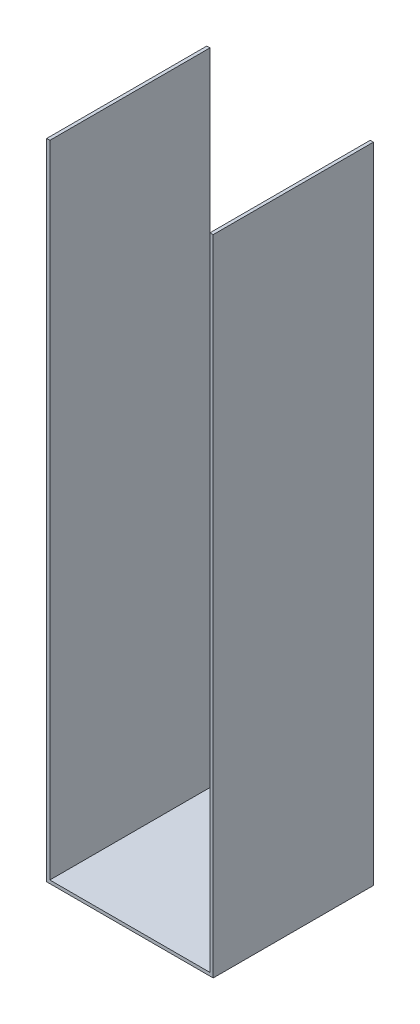
ISO-10303-21;
HEADER;
FILE_DESCRIPTION(('STEP AP214'),'2;1');
FILE_NAME('part.step','',(''),(''),'','','');
FILE_SCHEMA(('AUTOMOTIVE_DESIGN { 1 0 10303 214 1 1 1 1 }'));
ENDSEC;
DATA;
#1=APPLICATION_CONTEXT('core data for automotive mechanical design processes');
#2=APPLICATION_PROTOCOL_DEFINITION('international standard','automotive_design',2000,#1);
#3=PRODUCT_CONTEXT('',#1,'mechanical');
#4=PRODUCT('Part','Part','',(#3));
#5=PRODUCT_RELATED_PRODUCT_CATEGORY('part','',(#4));
#6=PRODUCT_DEFINITION_FORMATION('','',#4);
#7=PRODUCT_DEFINITION_CONTEXT('part definition',#1,'design');
#8=PRODUCT_DEFINITION('design','',#6,#7);
#9=PRODUCT_DEFINITION_SHAPE('','',#8);
#10=(LENGTH_UNIT() NAMED_UNIT(*) SI_UNIT(.MILLI.,.METRE.));
#11=(NAMED_UNIT(*) PLANE_ANGLE_UNIT() SI_UNIT($,.RADIAN.));
#12=(NAMED_UNIT(*) SI_UNIT($,.STERADIAN.) SOLID_ANGLE_UNIT());
#13=UNCERTAINTY_MEASURE_WITH_UNIT(LENGTH_MEASURE(1.E-05),#10,'distance_accuracy_value','');
#14=(GEOMETRIC_REPRESENTATION_CONTEXT(3) GLOBAL_UNCERTAINTY_ASSIGNED_CONTEXT((#13)) GLOBAL_UNIT_ASSIGNED_CONTEXT((#10,
#11,#12)) REPRESENTATION_CONTEXT('',''));
#15=CARTESIAN_POINT('',(0.,0.,0.));
#16=DIRECTION('',(0.,0.,1.));
#17=DIRECTION('',(1.,0.,0.));
#18=AXIS2_PLACEMENT_3D('',#15,#16,#17);
#19=CARTESIAN_POINT('',(-200.,0.,10000.));
#20=DIRECTION('',(0.,-1.,0.));
#21=DIRECTION('',(0.,0.,-1.));
#22=AXIS2_PLACEMENT_3D('',#19,#20,#21);
#23=PLANE('',#22);
#24=DIRECTION('',(-1.,0.,0.));
#25=VECTOR('',#24,1.);
#26=CARTESIAN_POINT('',(-200.,0.,0.));
#27=LINE('',#26,#25);
#28=CARTESIAN_POINT('',(0.,0.,0.));
#29=VERTEX_POINT('',#28);
#30=CARTESIAN_POINT('',(-200.,0.,0.));
#31=VERTEX_POINT('',#30);
#32=EDGE_CURVE('E139',#29,#31,#27,.T.);
#33=ORIENTED_EDGE('',*,*,#32,.T.);
#34=DIRECTION('',(0.,0.,-1.));
#35=VECTOR('',#34,1.);
#36=CARTESIAN_POINT('',(-200.,0.,10000.));
#37=LINE('',#36,#35);
#38=CARTESIAN_POINT('',(-200.,0.,10000.));
#39=VERTEX_POINT('',#38);
#40=EDGE_CURVE('E11',#39,#31,#37,.T.);
#41=ORIENTED_EDGE('',*,*,#40,.F.);
#42=DIRECTION('',(-1.,0.,0.));
#43=VECTOR('',#42,1.);
#44=CARTESIAN_POINT('',(-200.,0.,10000.));
#45=LINE('',#44,#43);
#46=CARTESIAN_POINT('',(0.,0.,10000.));
#47=VERTEX_POINT('',#46);
#48=EDGE_CURVE('E153',#47,#39,#45,.T.);
#49=ORIENTED_EDGE('',*,*,#48,.F.);
#50=DIRECTION('',(0.,0.,-1.));
#51=VECTOR('',#50,1.);
#52=CARTESIAN_POINT('',(0.,0.,10000.));
#53=LINE('',#52,#51);
#54=EDGE_CURVE('E135',#47,#29,#53,.T.);
#55=ORIENTED_EDGE('',*,*,#54,.T.);
#56=EDGE_LOOP('',(#33,#41,#49,#55));
#57=FACE_BOUND('',#56,.T.);
#58=ADVANCED_FACE('F43',(#57),#23,.F.);
#59=CARTESIAN_POINT('',(-200.,0.,10000.));
#60=DIRECTION('',(1.,0.,0.));
#61=DIRECTION('',(0.,1.,0.));
#62=AXIS2_PLACEMENT_3D('',#59,#60,#61);
#63=PLANE('',#62);
#64=DIRECTION('',(0.,-1.,0.));
#65=VECTOR('',#64,1.);
#66=CARTESIAN_POINT('',(-200.,0.,0.));
#67=LINE('',#66,#65);
#68=CARTESIAN_POINT('',(-199.999999999998,-40200.,0.));
#69=VERTEX_POINT('',#68);
#70=EDGE_CURVE('E142',#31,#69,#67,.T.);
#71=ORIENTED_EDGE('',*,*,#70,.T.);
#72=DIRECTION('',(0.,0.,-1.));
#73=VECTOR('',#72,1.);
#74=CARTESIAN_POINT('',(-199.999999999998,-40200.,10000.));
#75=LINE('',#74,#73);
#76=CARTESIAN_POINT('',(-199.999999999998,-40200.,10000.));
#77=VERTEX_POINT('',#76);
#78=EDGE_CURVE('E51',#77,#69,#75,.T.);
#79=ORIENTED_EDGE('',*,*,#78,.F.);
#80=DIRECTION('',(0.,-1.,0.));
#81=VECTOR('',#80,1.);
#82=CARTESIAN_POINT('',(-200.,0.,10000.));
#83=LINE('',#82,#81);
#84=EDGE_CURVE('E102',#39,#77,#83,.T.);
#85=ORIENTED_EDGE('',*,*,#84,.F.);
#86=ORIENTED_EDGE('',*,*,#40,.T.);
#87=EDGE_LOOP('',(#71,#79,#85,#86));
#88=FACE_BOUND('',#87,.T.);
#89=ADVANCED_FACE('F188',(#88),#63,.F.);
#90=CARTESIAN_POINT('',(-199.999999999998,-40200.,10000.));
#91=DIRECTION('',(0.,1.,0.));
#92=DIRECTION('',(0.,0.,1.));
#93=AXIS2_PLACEMENT_3D('',#90,#91,#92);
#94=PLANE('',#93);
#95=DIRECTION('',(1.,0.,0.));
#96=VECTOR('',#95,1.);
#97=CARTESIAN_POINT('',(-199.999999999998,-40200.,0.));
#98=LINE('',#97,#96);
#99=CARTESIAN_POINT('',(10200.,-40200.,0.));
#100=VERTEX_POINT('',#99);
#101=EDGE_CURVE('E144',#69,#100,#98,.T.);
#102=ORIENTED_EDGE('',*,*,#101,.T.);
#103=DIRECTION('',(0.,0.,-1.));
#104=VECTOR('',#103,1.);
#105=CARTESIAN_POINT('',(10200.,-40200.,10000.));
#106=LINE('',#105,#104);
#107=CARTESIAN_POINT('',(10200.,-40200.,10000.));
#108=VERTEX_POINT('',#107);
#109=EDGE_CURVE('E160',#108,#100,#106,.T.);
#110=ORIENTED_EDGE('',*,*,#109,.F.);
#111=DIRECTION('',(1.,0.,0.));
#112=VECTOR('',#111,1.);
#113=CARTESIAN_POINT('',(-199.999999999998,-40200.,10000.));
#114=LINE('',#113,#112);
#115=EDGE_CURVE('E168',#77,#108,#114,.T.);
#116=ORIENTED_EDGE('',*,*,#115,.F.);
#117=ORIENTED_EDGE('',*,*,#78,.T.);
#118=EDGE_LOOP('',(#102,#110,#116,#117));
#119=FACE_BOUND('',#118,.T.);
#120=ADVANCED_FACE('F166',(#119),#94,.F.);
#121=CARTESIAN_POINT('',(10200.,-40200.,10000.));
#122=DIRECTION('',(-1.,0.,0.));
#123=DIRECTION('',(0.,0.,1.));
#124=AXIS2_PLACEMENT_3D('',#121,#122,#123);
#125=PLANE('',#124);
#126=DIRECTION('',(0.,1.,0.));
#127=VECTOR('',#126,1.);
#128=CARTESIAN_POINT('',(10200.,-40200.,0.));
#129=LINE('',#128,#127);
#130=CARTESIAN_POINT('',(10200.,0.,0.));
#131=VERTEX_POINT('',#130);
#132=EDGE_CURVE('E146',#100,#131,#129,.T.);
#133=ORIENTED_EDGE('',*,*,#132,.T.);
#134=DIRECTION('',(0.,0.,-1.));
#135=VECTOR('',#134,1.);
#136=CARTESIAN_POINT('',(10200.,0.,10000.));
#137=LINE('',#136,#135);
#138=CARTESIAN_POINT('',(10200.,0.,10000.));
#139=VERTEX_POINT('',#138);
#140=EDGE_CURVE('E157',#139,#131,#137,.T.);
#141=ORIENTED_EDGE('',*,*,#140,.F.);
#142=DIRECTION('',(0.,1.,0.));
#143=VECTOR('',#142,1.);
#144=CARTESIAN_POINT('',(10200.,-40200.,10000.));
#145=LINE('',#144,#143);
#146=EDGE_CURVE('E180',#108,#139,#145,.T.);
#147=ORIENTED_EDGE('',*,*,#146,.F.);
#148=ORIENTED_EDGE('',*,*,#109,.T.);
#149=EDGE_LOOP('',(#133,#141,#147,#148));
#150=FACE_BOUND('',#149,.T.);
#151=ADVANCED_FACE('F176',(#150),#125,.F.);
#152=CARTESIAN_POINT('',(10000.,0.,10000.));
#153=DIRECTION('',(0.,-1.,0.));
#154=DIRECTION('',(0.,0.,-1.));
#155=AXIS2_PLACEMENT_3D('',#152,#153,#154);
#156=PLANE('',#155);
#157=DIRECTION('',(-1.,0.,0.));
#158=VECTOR('',#157,1.);
#159=CARTESIAN_POINT('',(10000.,0.,0.));
#160=LINE('',#159,#158);
#161=CARTESIAN_POINT('',(10000.,0.,0.));
#162=VERTEX_POINT('',#161);
#163=EDGE_CURVE('E148',#131,#162,#160,.T.);
#164=ORIENTED_EDGE('',*,*,#163,.T.);
#165=DIRECTION('',(0.,0.,-1.));
#166=VECTOR('',#165,1.);
#167=CARTESIAN_POINT('',(10000.,0.,10000.));
#168=LINE('',#167,#166);
#169=CARTESIAN_POINT('',(10000.,0.,10000.));
#170=VERTEX_POINT('',#169);
#171=EDGE_CURVE('E130',#170,#162,#168,.T.);
#172=ORIENTED_EDGE('',*,*,#171,.F.);
#173=DIRECTION('',(-1.,0.,0.));
#174=VECTOR('',#173,1.);
#175=CARTESIAN_POINT('',(10000.,0.,10000.));
#176=LINE('',#175,#174);
#177=EDGE_CURVE('E121',#139,#170,#176,.T.);
#178=ORIENTED_EDGE('',*,*,#177,.F.);
#179=ORIENTED_EDGE('',*,*,#140,.T.);
#180=EDGE_LOOP('',(#164,#172,#178,#179));
#181=FACE_BOUND('',#180,.T.);
#182=ADVANCED_FACE('F179',(#181),#156,.F.);
#183=CARTESIAN_POINT('',(10000.,-40000.,10000.));
#184=DIRECTION('',(1.,0.,0.));
#185=DIRECTION('',(0.,0.,-1.));
#186=AXIS2_PLACEMENT_3D('',#183,#184,#185);
#187=PLANE('',#186);
#188=DIRECTION('',(0.,-1.,0.));
#189=VECTOR('',#188,1.);
#190=CARTESIAN_POINT('',(10000.,-40000.,0.));
#191=LINE('',#190,#189);
#192=CARTESIAN_POINT('',(10000.,-40000.,0.));
#193=VERTEX_POINT('',#192);
#194=EDGE_CURVE('E129',#162,#193,#191,.T.);
#195=ORIENTED_EDGE('',*,*,#194,.T.);
#196=DIRECTION('',(0.,0.,-1.));
#197=VECTOR('',#196,1.);
#198=CARTESIAN_POINT('',(10000.,-40000.,10000.));
#199=LINE('',#198,#197);
#200=CARTESIAN_POINT('',(10000.,-40000.,10000.));
#201=VERTEX_POINT('',#200);
#202=EDGE_CURVE('E126',#201,#193,#199,.T.);
#203=ORIENTED_EDGE('',*,*,#202,.F.);
#204=DIRECTION('',(0.,-1.,0.));
#205=VECTOR('',#204,1.);
#206=CARTESIAN_POINT('',(10000.,-40000.,10000.));
#207=LINE('',#206,#205);
#208=EDGE_CURVE('E115',#170,#201,#207,.T.);
#209=ORIENTED_EDGE('',*,*,#208,.F.);
#210=ORIENTED_EDGE('',*,*,#171,.T.);
#211=EDGE_LOOP('',(#195,#203,#209,#210));
#212=FACE_BOUND('',#211,.T.);
#213=ADVANCED_FACE('F127',(#212),#187,.F.);
#214=CARTESIAN_POINT('',(4.89858719658941E-12,-40000.,10000.));
#215=DIRECTION('',(0.,-1.,0.));
#216=DIRECTION('',(0.,0.,-1.));
#217=AXIS2_PLACEMENT_3D('',#214,#215,#216);
#218=PLANE('',#217);
#219=DIRECTION('',(-1.,0.,0.));
#220=VECTOR('',#219,1.);
#221=CARTESIAN_POINT('',(4.89858719658941E-12,-40000.,0.));
#222=LINE('',#221,#220);
#223=CARTESIAN_POINT('',(4.89858719658941E-12,-40000.,0.));
#224=VERTEX_POINT('',#223);
#225=EDGE_CURVE('E88',#193,#224,#222,.T.);
#226=ORIENTED_EDGE('',*,*,#225,.T.);
#227=DIRECTION('',(0.,0.,-1.));
#228=VECTOR('',#227,1.);
#229=CARTESIAN_POINT('',(4.89858719658941E-12,-40000.,10000.));
#230=LINE('',#229,#228);
#231=CARTESIAN_POINT('',(4.89858719658941E-12,-40000.,10000.));
#232=VERTEX_POINT('',#231);
#233=EDGE_CURVE('E131',#232,#224,#230,.T.);
#234=ORIENTED_EDGE('',*,*,#233,.F.);
#235=DIRECTION('',(-1.,0.,0.));
#236=VECTOR('',#235,1.);
#237=CARTESIAN_POINT('',(4.89858719658941E-12,-40000.,10000.));
#238=LINE('',#237,#236);
#239=EDGE_CURVE('E119',#201,#232,#238,.T.);
#240=ORIENTED_EDGE('',*,*,#239,.F.);
#241=ORIENTED_EDGE('',*,*,#202,.T.);
#242=EDGE_LOOP('',(#226,#234,#240,#241));
#243=FACE_BOUND('',#242,.T.);
#244=ADVANCED_FACE('F133',(#243),#218,.F.);
#245=CARTESIAN_POINT('',(0.,0.,10000.));
#246=DIRECTION('',(-1.,0.,0.));
#247=DIRECTION('',(0.,-1.,0.));
#248=AXIS2_PLACEMENT_3D('',#245,#246,#247);
#249=PLANE('',#248);
#250=DIRECTION('',(0.,1.,0.));
#251=VECTOR('',#250,1.);
#252=CARTESIAN_POINT('',(0.,0.,0.));
#253=LINE('',#252,#251);
#254=EDGE_CURVE('E94',#224,#29,#253,.T.);
#255=ORIENTED_EDGE('',*,*,#254,.T.);
#256=ORIENTED_EDGE('',*,*,#54,.F.);
#257=DIRECTION('',(0.,1.,0.));
#258=VECTOR('',#257,1.);
#259=CARTESIAN_POINT('',(0.,0.,10000.));
#260=LINE('',#259,#258);
#261=EDGE_CURVE('E59',#232,#47,#260,.T.);
#262=ORIENTED_EDGE('',*,*,#261,.F.);
#263=ORIENTED_EDGE('',*,*,#233,.T.);
#264=EDGE_LOOP('',(#255,#256,#262,#263));
#265=FACE_BOUND('',#264,.T.);
#266=ADVANCED_FACE('F204',(#265),#249,.F.);
#267=CARTESIAN_POINT('',(0.,0.,10000.));
#268=DIRECTION('',(0.,0.,-1.));
#269=DIRECTION('',(-1.,0.,0.));
#270=AXIS2_PLACEMENT_3D('',#267,#268,#269);
#271=PLANE('',#270);
#272=ORIENTED_EDGE('',*,*,#48,.T.);
#273=ORIENTED_EDGE('',*,*,#84,.T.);
#274=ORIENTED_EDGE('',*,*,#115,.T.);
#275=ORIENTED_EDGE('',*,*,#146,.T.);
#276=ORIENTED_EDGE('',*,*,#177,.T.);
#277=ORIENTED_EDGE('',*,*,#208,.T.);
#278=ORIENTED_EDGE('',*,*,#239,.T.);
#279=ORIENTED_EDGE('',*,*,#261,.T.);
#280=EDGE_LOOP('',(#272,#273,#274,#275,#276,#277,#278,#279));
#281=FACE_BOUND('',#280,.T.);
#282=ADVANCED_FACE('F117',(#281),#271,.F.);
#283=CARTESIAN_POINT('',(0.,0.,0.));
#284=DIRECTION('',(0.,0.,-1.));
#285=DIRECTION('',(-1.,0.,0.));
#286=AXIS2_PLACEMENT_3D('',#283,#284,#285);
#287=PLANE('',#286);
#288=ORIENTED_EDGE('',*,*,#32,.F.);
#289=ORIENTED_EDGE('',*,*,#254,.F.);
#290=ORIENTED_EDGE('',*,*,#225,.F.);
#291=ORIENTED_EDGE('',*,*,#194,.F.);
#292=ORIENTED_EDGE('',*,*,#163,.F.);
#293=ORIENTED_EDGE('',*,*,#132,.F.);
#294=ORIENTED_EDGE('',*,*,#101,.F.);
#295=ORIENTED_EDGE('',*,*,#70,.F.);
#296=EDGE_LOOP('',(#288,#289,#290,#291,#292,#293,#294,#295));
#297=FACE_BOUND('',#296,.T.);
#298=ADVANCED_FACE('F172',(#297),#287,.T.);
#299=CLOSED_SHELL('',(#58,#89,#120,#151,#182,#213,#244,#266,#282,#298));
#300=MANIFOLD_SOLID_BREP('B2',#299);
#301=ADVANCED_BREP_SHAPE_REPRESENTATION('',(#18,#300),#14);
#302=SHAPE_DEFINITION_REPRESENTATION(#9,#301);
ENDSEC;
END-ISO-10303-21;
